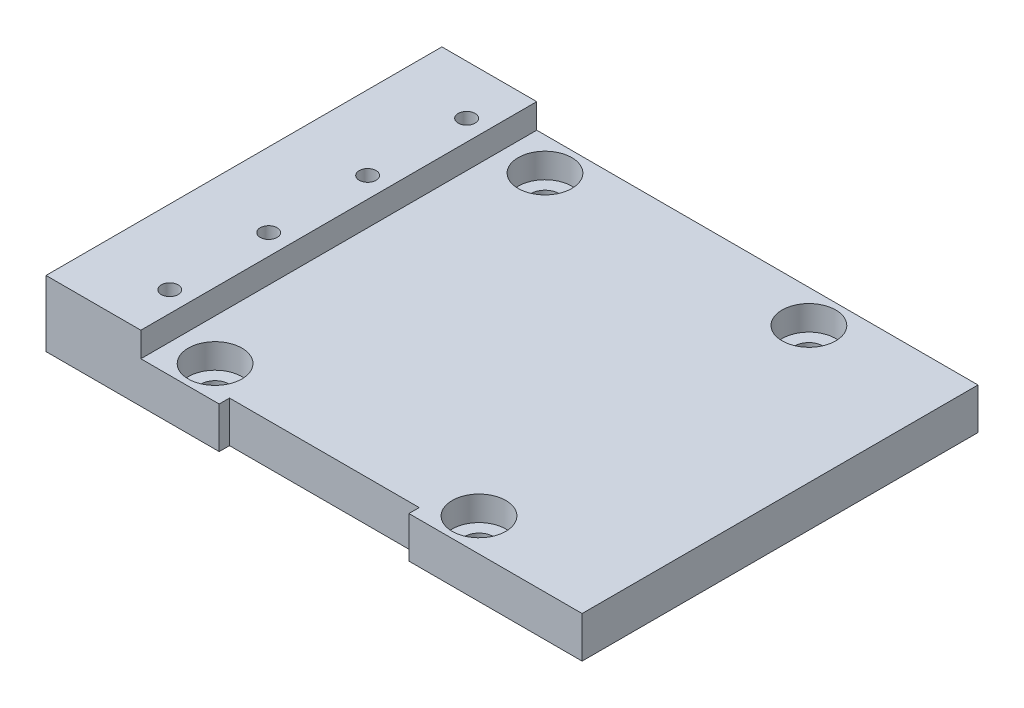
ISO-10303-21;
HEADER;
FILE_DESCRIPTION(('STEP AP214'),'2;1');
FILE_NAME('part.step','',(''),(''),'','','');
FILE_SCHEMA(('AUTOMOTIVE_DESIGN { 1 0 10303 214 1 1 1 1 }'));
ENDSEC;
DATA;
#1=APPLICATION_CONTEXT('core data for automotive mechanical design processes');
#2=APPLICATION_PROTOCOL_DEFINITION('international standard','automotive_design',2000,#1);
#3=PRODUCT_CONTEXT('',#1,'mechanical');
#4=PRODUCT('Part','Part','',(#3));
#5=PRODUCT_RELATED_PRODUCT_CATEGORY('part','',(#4));
#6=PRODUCT_DEFINITION_FORMATION('','',#4);
#7=PRODUCT_DEFINITION_CONTEXT('part definition',#1,'design');
#8=PRODUCT_DEFINITION('design','',#6,#7);
#9=PRODUCT_DEFINITION_SHAPE('','',#8);
#10=(LENGTH_UNIT() NAMED_UNIT(*) SI_UNIT(.MILLI.,.METRE.));
#11=(NAMED_UNIT(*) PLANE_ANGLE_UNIT() SI_UNIT($,.RADIAN.));
#12=(NAMED_UNIT(*) SI_UNIT($,.STERADIAN.) SOLID_ANGLE_UNIT());
#13=UNCERTAINTY_MEASURE_WITH_UNIT(LENGTH_MEASURE(1.E-05),#10,'distance_accuracy_value','');
#14=(GEOMETRIC_REPRESENTATION_CONTEXT(3) GLOBAL_UNCERTAINTY_ASSIGNED_CONTEXT((#13)) GLOBAL_UNIT_ASSIGNED_CONTEXT((#10,
#11,#12)) REPRESENTATION_CONTEXT('',''));
#15=CARTESIAN_POINT('',(0.,0.,0.));
#16=DIRECTION('',(0.,0.,1.));
#17=DIRECTION('',(1.,0.,0.));
#18=AXIS2_PLACEMENT_3D('',#15,#16,#17);
#19=CARTESIAN_POINT('',(-32.5,5.,24.));
#20=DIRECTION('',(0.,0.,-1.));
#21=DIRECTION('',(-1.,0.,0.));
#22=AXIS2_PLACEMENT_3D('',#19,#20,#21);
#23=PLANE('',#22);
#24=DIRECTION('',(1.,0.,0.));
#25=VECTOR('',#24,1.);
#26=CARTESIAN_POINT('',(-32.5,0.,24.));
#27=LINE('',#26,#25);
#28=CARTESIAN_POINT('',(-32.5,0.,24.));
#29=VERTEX_POINT('',#28);
#30=CARTESIAN_POINT('',(-11.5,0.,24.));
#31=VERTEX_POINT('',#30);
#32=EDGE_CURVE('E288',#29,#31,#27,.T.);
#33=ORIENTED_EDGE('',*,*,#32,.T.);
#34=DIRECTION('',(0.,-1.,0.));
#35=VECTOR('',#34,1.);
#36=CARTESIAN_POINT('',(-11.5,5.,24.));
#37=LINE('',#36,#35);
#38=CARTESIAN_POINT('',(-11.5,5.,24.));
#39=VERTEX_POINT('',#38);
#40=EDGE_CURVE('E326',#39,#31,#37,.T.);
#41=ORIENTED_EDGE('',*,*,#40,.F.);
#42=DIRECTION('',(1.,0.,0.));
#43=VECTOR('',#42,1.);
#44=CARTESIAN_POINT('',(-32.5,5.,24.));
#45=LINE('',#44,#43);
#46=CARTESIAN_POINT('',(-21.,5.,24.));
#47=VERTEX_POINT('',#46);
#48=EDGE_CURVE('E292',#47,#39,#45,.T.);
#49=ORIENTED_EDGE('',*,*,#48,.F.);
#50=DIRECTION('',(0.,-1.,0.));
#51=VECTOR('',#50,1.);
#52=CARTESIAN_POINT('',(-21.,8.,24.));
#53=LINE('',#52,#51);
#54=CARTESIAN_POINT('',(-21.,8.,24.));
#55=VERTEX_POINT('',#54);
#56=EDGE_CURVE('E278',#55,#47,#53,.T.);
#57=ORIENTED_EDGE('',*,*,#56,.F.);
#58=DIRECTION('',(1.,0.,0.));
#59=VECTOR('',#58,1.);
#60=CARTESIAN_POINT('',(-32.5,8.,24.));
#61=LINE('',#60,#59);
#62=CARTESIAN_POINT('',(-32.5,8.,24.));
#63=VERTEX_POINT('',#62);
#64=EDGE_CURVE('E262',#63,#55,#61,.T.);
#65=ORIENTED_EDGE('',*,*,#64,.F.);
#66=DIRECTION('',(0.,-1.,0.));
#67=VECTOR('',#66,1.);
#68=CARTESIAN_POINT('',(-32.5,5.,24.));
#69=LINE('',#68,#67);
#70=EDGE_CURVE('E311',#63,#29,#69,.T.);
#71=ORIENTED_EDGE('',*,*,#70,.T.);
#72=EDGE_LOOP('',(#33,#41,#49,#57,#65,#71));
#73=FACE_BOUND('',#72,.T.);
#74=ADVANCED_FACE('F50',(#73),#23,.F.);
#75=CARTESIAN_POINT('',(32.5,5.,-24.));
#76=DIRECTION('',(-1.,0.,0.));
#77=DIRECTION('',(0.,0.,1.));
#78=AXIS2_PLACEMENT_3D('',#75,#76,#77);
#79=PLANE('',#78);
#80=DIRECTION('',(0.,0.,-1.));
#81=VECTOR('',#80,1.);
#82=CARTESIAN_POINT('',(32.5,0.,-24.));
#83=LINE('',#82,#81);
#84=CARTESIAN_POINT('',(32.5,0.,24.));
#85=VERTEX_POINT('',#84);
#86=CARTESIAN_POINT('',(32.5,0.,-24.));
#87=VERTEX_POINT('',#86);
#88=EDGE_CURVE('E282',#85,#87,#83,.T.);
#89=ORIENTED_EDGE('',*,*,#88,.T.);
#90=DIRECTION('',(0.,-1.,0.));
#91=VECTOR('',#90,1.);
#92=CARTESIAN_POINT('',(32.5,5.,-24.));
#93=LINE('',#92,#91);
#94=CARTESIAN_POINT('',(32.5,5.,-24.));
#95=VERTEX_POINT('',#94);
#96=EDGE_CURVE('E11',#95,#87,#93,.T.);
#97=ORIENTED_EDGE('',*,*,#96,.F.);
#98=DIRECTION('',(0.,0.,-1.));
#99=VECTOR('',#98,1.);
#100=CARTESIAN_POINT('',(32.5,5.,-24.));
#101=LINE('',#100,#99);
#102=CARTESIAN_POINT('',(32.5,5.,24.));
#103=VERTEX_POINT('',#102);
#104=EDGE_CURVE('E283',#103,#95,#101,.T.);
#105=ORIENTED_EDGE('',*,*,#104,.F.);
#106=DIRECTION('',(0.,-1.,0.));
#107=VECTOR('',#106,1.);
#108=CARTESIAN_POINT('',(32.5,5.,24.));
#109=LINE('',#108,#107);
#110=EDGE_CURVE('E295',#103,#85,#109,.T.);
#111=ORIENTED_EDGE('',*,*,#110,.T.);
#112=EDGE_LOOP('',(#89,#97,#105,#111));
#113=FACE_BOUND('',#112,.T.);
#114=ADVANCED_FACE('F52',(#113),#79,.F.);
#115=CARTESIAN_POINT('',(-32.5,5.,-24.));
#116=DIRECTION('',(0.,0.,1.));
#117=DIRECTION('',(1.,0.,0.));
#118=AXIS2_PLACEMENT_3D('',#115,#116,#117);
#119=PLANE('',#118);
#120=DIRECTION('',(-1.,0.,0.));
#121=VECTOR('',#120,1.);
#122=CARTESIAN_POINT('',(-32.5,0.,-24.));
#123=LINE('',#122,#121);
#124=CARTESIAN_POINT('',(-32.5,0.,-24.));
#125=VERTEX_POINT('',#124);
#126=EDGE_CURVE('E299',#87,#125,#123,.T.);
#127=ORIENTED_EDGE('',*,*,#126,.T.);
#128=DIRECTION('',(0.,-1.,0.));
#129=VECTOR('',#128,1.);
#130=CARTESIAN_POINT('',(-32.5,5.,-24.));
#131=LINE('',#130,#129);
#132=CARTESIAN_POINT('',(-32.5,8.,-24.));
#133=VERTEX_POINT('',#132);
#134=EDGE_CURVE('E59',#133,#125,#131,.T.);
#135=ORIENTED_EDGE('',*,*,#134,.F.);
#136=DIRECTION('',(-1.,0.,0.));
#137=VECTOR('',#136,1.);
#138=CARTESIAN_POINT('',(-32.5,8.,-24.));
#139=LINE('',#138,#137);
#140=CARTESIAN_POINT('',(-21.,8.,-24.));
#141=VERTEX_POINT('',#140);
#142=EDGE_CURVE('E268',#141,#133,#139,.T.);
#143=ORIENTED_EDGE('',*,*,#142,.F.);
#144=DIRECTION('',(0.,-1.,0.));
#145=VECTOR('',#144,1.);
#146=CARTESIAN_POINT('',(-21.,8.,-24.));
#147=LINE('',#146,#145);
#148=CARTESIAN_POINT('',(-21.,5.,-24.));
#149=VERTEX_POINT('',#148);
#150=EDGE_CURVE('E272',#141,#149,#147,.T.);
#151=ORIENTED_EDGE('',*,*,#150,.T.);
#152=DIRECTION('',(-1.,0.,0.));
#153=VECTOR('',#152,1.);
#154=CARTESIAN_POINT('',(-32.5,5.,-24.));
#155=LINE('',#154,#153);
#156=EDGE_CURVE('E287',#95,#149,#155,.T.);
#157=ORIENTED_EDGE('',*,*,#156,.F.);
#158=ORIENTED_EDGE('',*,*,#96,.T.);
#159=EDGE_LOOP('',(#127,#135,#143,#151,#157,#158));
#160=FACE_BOUND('',#159,.T.);
#161=ADVANCED_FACE('F333',(#160),#119,.F.);
#162=CARTESIAN_POINT('',(-32.5,5.,-24.));
#163=DIRECTION('',(1.,0.,0.));
#164=DIRECTION('',(0.,0.,-1.));
#165=AXIS2_PLACEMENT_3D('',#162,#163,#164);
#166=PLANE('',#165);
#167=DIRECTION('',(0.,0.,1.));
#168=VECTOR('',#167,1.);
#169=CARTESIAN_POINT('',(-32.5,0.,-24.));
#170=LINE('',#169,#168);
#171=EDGE_CURVE('E302',#125,#29,#170,.T.);
#172=ORIENTED_EDGE('',*,*,#171,.T.);
#173=ORIENTED_EDGE('',*,*,#70,.F.);
#174=DIRECTION('',(0.,0.,1.));
#175=VECTOR('',#174,1.);
#176=CARTESIAN_POINT('',(-32.5,8.,-24.));
#177=LINE('',#176,#175);
#178=EDGE_CURVE('E258',#133,#63,#177,.T.);
#179=ORIENTED_EDGE('',*,*,#178,.F.);
#180=ORIENTED_EDGE('',*,*,#134,.T.);
#181=EDGE_LOOP('',(#172,#173,#179,#180));
#182=FACE_BOUND('',#181,.T.);
#183=ADVANCED_FACE('F320',(#182),#166,.F.);
#184=CARTESIAN_POINT('',(11.5,5.,24.));
#185=VERTEX_POINT('',#184);
#186=EDGE_CURVE('E291',#185,#103,#45,.T.);
#187=ORIENTED_EDGE('',*,*,#186,.F.);
#188=DIRECTION('',(0.,1.,0.));
#189=VECTOR('',#188,1.);
#190=CARTESIAN_POINT('',(11.5,5.,24.));
#191=LINE('',#190,#189);
#192=CARTESIAN_POINT('',(11.5,0.,24.));
#193=VERTEX_POINT('',#192);
#194=EDGE_CURVE('E365',#193,#185,#191,.T.);
#195=ORIENTED_EDGE('',*,*,#194,.F.);
#196=EDGE_CURVE('E150',#193,#85,#27,.T.);
#197=ORIENTED_EDGE('',*,*,#196,.T.);
#198=ORIENTED_EDGE('',*,*,#110,.F.);
#199=EDGE_LOOP('',(#187,#195,#197,#198));
#200=FACE_BOUND('',#199,.T.);
#201=ADVANCED_FACE('F351',(#200),#23,.F.);
#202=CARTESIAN_POINT('',(0.,5.,0.));
#203=DIRECTION('',(0.,1.,0.));
#204=DIRECTION('',(0.,0.,1.));
#205=AXIS2_PLACEMENT_3D('',#202,#203,#204);
#206=PLANE('',#205);
#207=DIRECTION('',(0.,0.,1.));
#208=VECTOR('',#207,1.);
#209=CARTESIAN_POINT('',(-11.5,5.,22.75));
#210=LINE('',#209,#208);
#211=CARTESIAN_POINT('',(-11.5,5.,22.75));
#212=VERTEX_POINT('',#211);
#213=EDGE_CURVE('E157',#212,#39,#210,.T.);
#214=ORIENTED_EDGE('',*,*,#213,.F.);
#215=DIRECTION('',(-1.,0.,0.));
#216=VECTOR('',#215,1.);
#217=CARTESIAN_POINT('',(-11.5,5.,22.75));
#218=LINE('',#217,#216);
#219=CARTESIAN_POINT('',(11.5,5.,22.75));
#220=VERTEX_POINT('',#219);
#221=EDGE_CURVE('E138',#220,#212,#218,.T.);
#222=ORIENTED_EDGE('',*,*,#221,.F.);
#223=DIRECTION('',(0.,0.,1.));
#224=VECTOR('',#223,1.);
#225=CARTESIAN_POINT('',(11.5,5.,22.75));
#226=LINE('',#225,#224);
#227=EDGE_CURVE('E135',#220,#185,#226,.T.);
#228=ORIENTED_EDGE('',*,*,#227,.T.);
#229=ORIENTED_EDGE('',*,*,#186,.T.);
#230=ORIENTED_EDGE('',*,*,#104,.T.);
#231=ORIENTED_EDGE('',*,*,#156,.T.);
#232=DIRECTION('',(0.,0.,-1.));
#233=VECTOR('',#232,1.);
#234=CARTESIAN_POINT('',(-21.,5.,-24.));
#235=LINE('',#234,#233);
#236=EDGE_CURVE('E74',#47,#149,#235,.T.);
#237=ORIENTED_EDGE('',*,*,#236,.F.);
#238=ORIENTED_EDGE('',*,*,#48,.T.);
#239=EDGE_LOOP('',(#214,#222,#228,#229,#230,#231,#237,#238));
#240=FACE_BOUND('',#239,.T.);
#241=CARTESIAN_POINT('',(-16.,5.,-20.));
#242=DIRECTION('',(0.,1.,0.));
#243=DIRECTION('',(0.,0.,1.));
#244=AXIS2_PLACEMENT_3D('',#241,#242,#243);
#245=CIRCLE('',#244,3.25);
#246=CARTESIAN_POINT('',(-16.,5.,-16.75));
#247=VERTEX_POINT('',#246);
#248=EDGE_CURVE('E162',#247,#247,#245,.T.);
#249=ORIENTED_EDGE('',*,*,#248,.F.);
#250=EDGE_LOOP('',(#249));
#251=FACE_BOUND('',#250,.T.);
#252=CARTESIAN_POINT('',(16.,5.,-20.));
#253=DIRECTION('',(0.,1.,0.));
#254=DIRECTION('',(0.,0.,1.));
#255=AXIS2_PLACEMENT_3D('',#252,#253,#254);
#256=CIRCLE('',#255,3.25);
#257=CARTESIAN_POINT('',(16.,5.,-16.75));
#258=VERTEX_POINT('',#257);
#259=EDGE_CURVE('E178',#258,#258,#256,.T.);
#260=ORIENTED_EDGE('',*,*,#259,.F.);
#261=EDGE_LOOP('',(#260));
#262=FACE_BOUND('',#261,.T.);
#263=CARTESIAN_POINT('',(-16.,5.,20.));
#264=DIRECTION('',(0.,1.,0.));
#265=DIRECTION('',(0.,0.,1.));
#266=AXIS2_PLACEMENT_3D('',#263,#264,#265);
#267=CIRCLE('',#266,3.25);
#268=CARTESIAN_POINT('',(-16.,5.,23.25));
#269=VERTEX_POINT('',#268);
#270=EDGE_CURVE('E194',#269,#269,#267,.T.);
#271=ORIENTED_EDGE('',*,*,#270,.F.);
#272=EDGE_LOOP('',(#271));
#273=FACE_BOUND('',#272,.T.);
#274=CARTESIAN_POINT('',(16.,5.,20.));
#275=DIRECTION('',(0.,1.,0.));
#276=DIRECTION('',(0.,0.,1.));
#277=AXIS2_PLACEMENT_3D('',#274,#275,#276);
#278=CIRCLE('',#277,3.25);
#279=CARTESIAN_POINT('',(16.,5.,23.25));
#280=VERTEX_POINT('',#279);
#281=EDGE_CURVE('E210',#280,#280,#278,.T.);
#282=ORIENTED_EDGE('',*,*,#281,.F.);
#283=EDGE_LOOP('',(#282));
#284=FACE_BOUND('',#283,.T.);
#285=ADVANCED_FACE('F345',(#240,#251,#262,#273,#284),#206,.T.);
#286=CARTESIAN_POINT('',(0.,0.,0.));
#287=DIRECTION('',(0.,1.,0.));
#288=DIRECTION('',(0.,0.,1.));
#289=AXIS2_PLACEMENT_3D('',#286,#287,#288);
#290=PLANE('',#289);
#291=CARTESIAN_POINT('',(-16.,0.,-20.));
#292=DIRECTION('',(0.,1.,0.));
#293=DIRECTION('',(0.,0.,1.));
#294=AXIS2_PLACEMENT_3D('',#291,#292,#293);
#295=CIRCLE('',#294,1.7);
#296=CARTESIAN_POINT('',(-16.,0.,-18.3));
#297=VERTEX_POINT('',#296);
#298=EDGE_CURVE('E174',#297,#297,#295,.T.);
#299=ORIENTED_EDGE('',*,*,#298,.T.);
#300=EDGE_LOOP('',(#299));
#301=FACE_BOUND('',#300,.T.);
#302=CARTESIAN_POINT('',(16.,0.,-20.));
#303=DIRECTION('',(0.,1.,0.));
#304=DIRECTION('',(0.,0.,1.));
#305=AXIS2_PLACEMENT_3D('',#302,#303,#304);
#306=CIRCLE('',#305,1.7);
#307=CARTESIAN_POINT('',(16.,0.,-18.3));
#308=VERTEX_POINT('',#307);
#309=EDGE_CURVE('E190',#308,#308,#306,.T.);
#310=ORIENTED_EDGE('',*,*,#309,.T.);
#311=EDGE_LOOP('',(#310));
#312=FACE_BOUND('',#311,.T.);
#313=CARTESIAN_POINT('',(-16.,0.,20.));
#314=DIRECTION('',(0.,1.,0.));
#315=DIRECTION('',(0.,0.,1.));
#316=AXIS2_PLACEMENT_3D('',#313,#314,#315);
#317=CIRCLE('',#316,1.7);
#318=CARTESIAN_POINT('',(-16.,0.,21.7));
#319=VERTEX_POINT('',#318);
#320=EDGE_CURVE('E206',#319,#319,#317,.T.);
#321=ORIENTED_EDGE('',*,*,#320,.T.);
#322=EDGE_LOOP('',(#321));
#323=FACE_BOUND('',#322,.T.);
#324=CARTESIAN_POINT('',(16.,0.,20.));
#325=DIRECTION('',(0.,1.,0.));
#326=DIRECTION('',(0.,0.,1.));
#327=AXIS2_PLACEMENT_3D('',#324,#325,#326);
#328=CIRCLE('',#327,1.7);
#329=CARTESIAN_POINT('',(16.,0.,21.7));
#330=VERTEX_POINT('',#329);
#331=EDGE_CURVE('E222',#330,#330,#328,.T.);
#332=ORIENTED_EDGE('',*,*,#331,.T.);
#333=EDGE_LOOP('',(#332));
#334=FACE_BOUND('',#333,.T.);
#335=DIRECTION('',(1.,0.,0.));
#336=VECTOR('',#335,1.);
#337=CARTESIAN_POINT('',(-11.5,0.,22.75));
#338=LINE('',#337,#336);
#339=CARTESIAN_POINT('',(-11.5,0.,22.75));
#340=VERTEX_POINT('',#339);
#341=CARTESIAN_POINT('',(11.5,0.,22.75));
#342=VERTEX_POINT('',#341);
#343=EDGE_CURVE('E139',#340,#342,#338,.T.);
#344=ORIENTED_EDGE('',*,*,#343,.F.);
#345=DIRECTION('',(0.,0.,1.));
#346=VECTOR('',#345,1.);
#347=CARTESIAN_POINT('',(-11.5,0.,22.75));
#348=LINE('',#347,#346);
#349=EDGE_CURVE('E152',#340,#31,#348,.T.);
#350=ORIENTED_EDGE('',*,*,#349,.T.);
#351=ORIENTED_EDGE('',*,*,#32,.F.);
#352=ORIENTED_EDGE('',*,*,#171,.F.);
#353=ORIENTED_EDGE('',*,*,#126,.F.);
#354=ORIENTED_EDGE('',*,*,#88,.F.);
#355=ORIENTED_EDGE('',*,*,#196,.F.);
#356=DIRECTION('',(0.,0.,1.));
#357=VECTOR('',#356,1.);
#358=CARTESIAN_POINT('',(11.5,0.,22.75));
#359=LINE('',#358,#357);
#360=EDGE_CURVE('E132',#342,#193,#359,.T.);
#361=ORIENTED_EDGE('',*,*,#360,.F.);
#362=EDGE_LOOP('',(#344,#350,#351,#352,#353,#354,#355,#361));
#363=FACE_BOUND('',#362,.T.);
#364=ADVANCED_FACE('F148',(#301,#312,#323,#334,#363),#290,.F.);
#365=CARTESIAN_POINT('',(-21.,8.,-24.));
#366=DIRECTION('',(-1.,0.,0.));
#367=DIRECTION('',(0.,0.,1.));
#368=AXIS2_PLACEMENT_3D('',#365,#366,#367);
#369=PLANE('',#368);
#370=ORIENTED_EDGE('',*,*,#236,.T.);
#371=ORIENTED_EDGE('',*,*,#150,.F.);
#372=DIRECTION('',(0.,0.,-1.));
#373=VECTOR('',#372,1.);
#374=CARTESIAN_POINT('',(-21.,8.,-24.));
#375=LINE('',#374,#373);
#376=EDGE_CURVE('E265',#55,#141,#375,.T.);
#377=ORIENTED_EDGE('',*,*,#376,.F.);
#378=ORIENTED_EDGE('',*,*,#56,.T.);
#379=EDGE_LOOP('',(#370,#371,#377,#378));
#380=FACE_BOUND('',#379,.T.);
#381=ADVANCED_FACE('F335',(#380),#369,.F.);
#382=CARTESIAN_POINT('',(0.,8.,0.));
#383=DIRECTION('',(0.,1.,0.));
#384=DIRECTION('',(0.,0.,1.));
#385=AXIS2_PLACEMENT_3D('',#382,#383,#384);
#386=PLANE('',#385);
#387=CARTESIAN_POINT('',(-23.5,8.,-18.));
#388=DIRECTION('',(0.,1.,0.));
#389=DIRECTION('',(0.,0.,1.));
#390=AXIS2_PLACEMENT_3D('',#387,#388,#389);
#391=CIRCLE('',#390,1.02499999999999);
#392=CARTESIAN_POINT('',(-23.5,8.,-16.975));
#393=VERTEX_POINT('',#392);
#394=EDGE_CURVE('E226',#393,#393,#391,.T.);
#395=ORIENTED_EDGE('',*,*,#394,.F.);
#396=EDGE_LOOP('',(#395));
#397=FACE_BOUND('',#396,.T.);
#398=CARTESIAN_POINT('',(-23.5,8.,-5.99999999999999));
#399=DIRECTION('',(0.,1.,0.));
#400=DIRECTION('',(0.,0.,1.));
#401=AXIS2_PLACEMENT_3D('',#398,#399,#400);
#402=CIRCLE('',#401,1.02499999999999);
#403=CARTESIAN_POINT('',(-23.5,8.,-4.975));
#404=VERTEX_POINT('',#403);
#405=EDGE_CURVE('E234',#404,#404,#402,.T.);
#406=ORIENTED_EDGE('',*,*,#405,.F.);
#407=EDGE_LOOP('',(#406));
#408=FACE_BOUND('',#407,.T.);
#409=CARTESIAN_POINT('',(-23.5,8.,18.));
#410=DIRECTION('',(0.,1.,0.));
#411=DIRECTION('',(0.,0.,1.));
#412=AXIS2_PLACEMENT_3D('',#409,#410,#411);
#413=CIRCLE('',#412,1.02499999999999);
#414=CARTESIAN_POINT('',(-23.5,8.,19.025));
#415=VERTEX_POINT('',#414);
#416=EDGE_CURVE('E242',#415,#415,#413,.T.);
#417=ORIENTED_EDGE('',*,*,#416,.F.);
#418=EDGE_LOOP('',(#417));
#419=FACE_BOUND('',#418,.T.);
#420=CARTESIAN_POINT('',(-23.5,8.,6.00000000000001));
#421=DIRECTION('',(0.,1.,0.));
#422=DIRECTION('',(0.,0.,1.));
#423=AXIS2_PLACEMENT_3D('',#420,#421,#422);
#424=CIRCLE('',#423,1.02499999999999);
#425=CARTESIAN_POINT('',(-23.5,8.,7.025));
#426=VERTEX_POINT('',#425);
#427=EDGE_CURVE('E250',#426,#426,#424,.T.);
#428=ORIENTED_EDGE('',*,*,#427,.F.);
#429=EDGE_LOOP('',(#428));
#430=FACE_BOUND('',#429,.T.);
#431=ORIENTED_EDGE('',*,*,#178,.T.);
#432=ORIENTED_EDGE('',*,*,#64,.T.);
#433=ORIENTED_EDGE('',*,*,#376,.T.);
#434=ORIENTED_EDGE('',*,*,#142,.T.);
#435=EDGE_LOOP('',(#431,#432,#433,#434));
#436=FACE_BOUND('',#435,.T.);
#437=ADVANCED_FACE('F331',(#397,#408,#419,#430,#436),#386,.T.);
#438=CARTESIAN_POINT('',(-23.5,1.65,6.00000000000001));
#439=DIRECTION('',(0.,-1.,0.));
#440=DIRECTION('',(0.,0.,-1.));
#441=AXIS2_PLACEMENT_3D('',#438,#439,#440);
#442=PLANE('',#441);
#443=CARTESIAN_POINT('',(-23.5,1.65,6.00000000000001));
#444=DIRECTION('',(0.,1.,0.));
#445=DIRECTION('',(0.,0.,1.));
#446=AXIS2_PLACEMENT_3D('',#443,#444,#445);
#447=CIRCLE('',#446,1.025);
#448=CARTESIAN_POINT('',(-23.5,1.65,7.02500000000001));
#449=VERTEX_POINT('',#448);
#450=EDGE_CURVE('E254',#449,#449,#447,.T.);
#451=ORIENTED_EDGE('',*,*,#450,.T.);
#452=EDGE_LOOP('',(#451));
#453=FACE_BOUND('',#452,.T.);
#454=ADVANCED_FACE('F342',(#453),#442,.F.);
#455=CARTESIAN_POINT('',(-23.5,8.,6.00000000000001));
#456=DIRECTION('',(0.,1.,0.));
#457=DIRECTION('',(0.,0.,1.));
#458=AXIS2_PLACEMENT_3D('',#455,#456,#457);
#459=CYLINDRICAL_SURFACE('',#458,1.02499999999999);
#460=ORIENTED_EDGE('',*,*,#450,.F.);
#461=EDGE_LOOP('',(#460));
#462=FACE_BOUND('',#461,.T.);
#463=ORIENTED_EDGE('',*,*,#427,.T.);
#464=EDGE_LOOP('',(#463));
#465=FACE_BOUND('',#464,.T.);
#466=ADVANCED_FACE('F533',(#462,#465),#459,.F.);
#467=CARTESIAN_POINT('',(-23.5,1.65,18.));
#468=DIRECTION('',(0.,-1.,0.));
#469=DIRECTION('',(0.,0.,-1.));
#470=AXIS2_PLACEMENT_3D('',#467,#468,#469);
#471=PLANE('',#470);
#472=CARTESIAN_POINT('',(-23.5,1.65,18.));
#473=DIRECTION('',(0.,1.,0.));
#474=DIRECTION('',(0.,0.,1.));
#475=AXIS2_PLACEMENT_3D('',#472,#473,#474);
#476=CIRCLE('',#475,1.025);
#477=CARTESIAN_POINT('',(-23.5,1.65,19.025));
#478=VERTEX_POINT('',#477);
#479=EDGE_CURVE('E246',#478,#478,#476,.T.);
#480=ORIENTED_EDGE('',*,*,#479,.T.);
#481=EDGE_LOOP('',(#480));
#482=FACE_BOUND('',#481,.T.);
#483=ADVANCED_FACE('F529',(#482),#471,.F.);
#484=CARTESIAN_POINT('',(-23.5,8.,18.));
#485=DIRECTION('',(0.,1.,0.));
#486=DIRECTION('',(0.,0.,1.));
#487=AXIS2_PLACEMENT_3D('',#484,#485,#486);
#488=CYLINDRICAL_SURFACE('',#487,1.02499999999999);
#489=ORIENTED_EDGE('',*,*,#479,.F.);
#490=EDGE_LOOP('',(#489));
#491=FACE_BOUND('',#490,.T.);
#492=ORIENTED_EDGE('',*,*,#416,.T.);
#493=EDGE_LOOP('',(#492));
#494=FACE_BOUND('',#493,.T.);
#495=ADVANCED_FACE('F525',(#491,#494),#488,.F.);
#496=CARTESIAN_POINT('',(-23.5,1.65,-5.99999999999999));
#497=DIRECTION('',(0.,-1.,0.));
#498=DIRECTION('',(0.,0.,-1.));
#499=AXIS2_PLACEMENT_3D('',#496,#497,#498);
#500=PLANE('',#499);
#501=CARTESIAN_POINT('',(-23.5,1.65,-5.99999999999999));
#502=DIRECTION('',(0.,1.,0.));
#503=DIRECTION('',(0.,0.,1.));
#504=AXIS2_PLACEMENT_3D('',#501,#502,#503);
#505=CIRCLE('',#504,1.025);
#506=CARTESIAN_POINT('',(-23.5,1.65,-4.97499999999999));
#507=VERTEX_POINT('',#506);
#508=EDGE_CURVE('E238',#507,#507,#505,.T.);
#509=ORIENTED_EDGE('',*,*,#508,.T.);
#510=EDGE_LOOP('',(#509));
#511=FACE_BOUND('',#510,.T.);
#512=ADVANCED_FACE('F521',(#511),#500,.F.);
#513=CARTESIAN_POINT('',(-23.5,8.,-5.99999999999999));
#514=DIRECTION('',(0.,1.,0.));
#515=DIRECTION('',(0.,0.,1.));
#516=AXIS2_PLACEMENT_3D('',#513,#514,#515);
#517=CYLINDRICAL_SURFACE('',#516,1.02499999999999);
#518=ORIENTED_EDGE('',*,*,#508,.F.);
#519=EDGE_LOOP('',(#518));
#520=FACE_BOUND('',#519,.T.);
#521=ORIENTED_EDGE('',*,*,#405,.T.);
#522=EDGE_LOOP('',(#521));
#523=FACE_BOUND('',#522,.T.);
#524=ADVANCED_FACE('F517',(#520,#523),#517,.F.);
#525=CARTESIAN_POINT('',(-23.5,1.65,-18.));
#526=DIRECTION('',(0.,-1.,0.));
#527=DIRECTION('',(0.,0.,-1.));
#528=AXIS2_PLACEMENT_3D('',#525,#526,#527);
#529=PLANE('',#528);
#530=CARTESIAN_POINT('',(-23.5,1.65,-18.));
#531=DIRECTION('',(0.,1.,0.));
#532=DIRECTION('',(0.,0.,1.));
#533=AXIS2_PLACEMENT_3D('',#530,#531,#532);
#534=CIRCLE('',#533,1.025);
#535=CARTESIAN_POINT('',(-23.5,1.65,-16.975));
#536=VERTEX_POINT('',#535);
#537=EDGE_CURVE('E230',#536,#536,#534,.T.);
#538=ORIENTED_EDGE('',*,*,#537,.T.);
#539=EDGE_LOOP('',(#538));
#540=FACE_BOUND('',#539,.T.);
#541=ADVANCED_FACE('F513',(#540),#529,.F.);
#542=CARTESIAN_POINT('',(-23.5,8.,-18.));
#543=DIRECTION('',(0.,1.,0.));
#544=DIRECTION('',(0.,0.,1.));
#545=AXIS2_PLACEMENT_3D('',#542,#543,#544);
#546=CYLINDRICAL_SURFACE('',#545,1.02499999999999);
#547=ORIENTED_EDGE('',*,*,#537,.F.);
#548=EDGE_LOOP('',(#547));
#549=FACE_BOUND('',#548,.T.);
#550=ORIENTED_EDGE('',*,*,#394,.T.);
#551=EDGE_LOOP('',(#550));
#552=FACE_BOUND('',#551,.T.);
#553=ADVANCED_FACE('F509',(#549,#552),#546,.F.);
#554=CARTESIAN_POINT('',(16.,5.,20.));
#555=DIRECTION('',(0.,1.,0.));
#556=DIRECTION('',(0.,0.,1.));
#557=AXIS2_PLACEMENT_3D('',#554,#555,#556);
#558=CYLINDRICAL_SURFACE('',#557,1.7);
#559=ORIENTED_EDGE('',*,*,#331,.F.);
#560=EDGE_LOOP('',(#559));
#561=FACE_BOUND('',#560,.T.);
#562=CARTESIAN_POINT('',(16.,2.,20.));
#563=DIRECTION('',(0.,1.,0.));
#564=DIRECTION('',(0.,0.,1.));
#565=AXIS2_PLACEMENT_3D('',#562,#563,#564);
#566=CIRCLE('',#565,1.7);
#567=CARTESIAN_POINT('',(16.,2.,21.7));
#568=VERTEX_POINT('',#567);
#569=EDGE_CURVE('E218',#568,#568,#566,.T.);
#570=ORIENTED_EDGE('',*,*,#569,.T.);
#571=EDGE_LOOP('',(#570));
#572=FACE_BOUND('',#571,.T.);
#573=ADVANCED_FACE('F501',(#561,#572),#558,.F.);
#574=CARTESIAN_POINT('',(17.7,2.,20.));
#575=DIRECTION('',(0.,-1.,0.));
#576=DIRECTION('',(0.,0.,-1.));
#577=AXIS2_PLACEMENT_3D('',#574,#575,#576);
#578=PLANE('',#577);
#579=ORIENTED_EDGE('',*,*,#569,.F.);
#580=EDGE_LOOP('',(#579));
#581=FACE_BOUND('',#580,.T.);
#582=CARTESIAN_POINT('',(16.,2.,20.));
#583=DIRECTION('',(0.,1.,0.));
#584=DIRECTION('',(0.,0.,1.));
#585=AXIS2_PLACEMENT_3D('',#582,#583,#584);
#586=CIRCLE('',#585,3.25);
#587=CARTESIAN_POINT('',(16.,2.,23.25));
#588=VERTEX_POINT('',#587);
#589=EDGE_CURVE('E214',#588,#588,#586,.T.);
#590=ORIENTED_EDGE('',*,*,#589,.T.);
#591=EDGE_LOOP('',(#590));
#592=FACE_BOUND('',#591,.T.);
#593=ADVANCED_FACE('F491',(#581,#592),#578,.F.);
#594=CARTESIAN_POINT('',(16.,5.,20.));
#595=DIRECTION('',(0.,1.,0.));
#596=DIRECTION('',(0.,0.,1.));
#597=AXIS2_PLACEMENT_3D('',#594,#595,#596);
#598=CYLINDRICAL_SURFACE('',#597,3.25);
#599=ORIENTED_EDGE('',*,*,#589,.F.);
#600=EDGE_LOOP('',(#599));
#601=FACE_BOUND('',#600,.T.);
#602=ORIENTED_EDGE('',*,*,#281,.T.);
#603=EDGE_LOOP('',(#602));
#604=FACE_BOUND('',#603,.T.);
#605=ADVANCED_FACE('F488',(#601,#604),#598,.F.);
#606=CARTESIAN_POINT('',(-16.,5.,20.));
#607=DIRECTION('',(0.,1.,0.));
#608=DIRECTION('',(0.,0.,1.));
#609=AXIS2_PLACEMENT_3D('',#606,#607,#608);
#610=CYLINDRICAL_SURFACE('',#609,1.7);
#611=ORIENTED_EDGE('',*,*,#320,.F.);
#612=EDGE_LOOP('',(#611));
#613=FACE_BOUND('',#612,.T.);
#614=CARTESIAN_POINT('',(-16.,2.,20.));
#615=DIRECTION('',(0.,1.,0.));
#616=DIRECTION('',(0.,0.,1.));
#617=AXIS2_PLACEMENT_3D('',#614,#615,#616);
#618=CIRCLE('',#617,1.7);
#619=CARTESIAN_POINT('',(-16.,2.,21.7));
#620=VERTEX_POINT('',#619);
#621=EDGE_CURVE('E202',#620,#620,#618,.T.);
#622=ORIENTED_EDGE('',*,*,#621,.T.);
#623=EDGE_LOOP('',(#622));
#624=FACE_BOUND('',#623,.T.);
#625=ADVANCED_FACE('F490',(#613,#624),#610,.F.);
#626=CARTESIAN_POINT('',(-14.3,2.,20.));
#627=DIRECTION('',(0.,-1.,0.));
#628=DIRECTION('',(0.,0.,-1.));
#629=AXIS2_PLACEMENT_3D('',#626,#627,#628);
#630=PLANE('',#629);
#631=ORIENTED_EDGE('',*,*,#621,.F.);
#632=EDGE_LOOP('',(#631));
#633=FACE_BOUND('',#632,.T.);
#634=CARTESIAN_POINT('',(-16.,2.,20.));
#635=DIRECTION('',(0.,1.,0.));
#636=DIRECTION('',(0.,0.,1.));
#637=AXIS2_PLACEMENT_3D('',#634,#635,#636);
#638=CIRCLE('',#637,3.25);
#639=CARTESIAN_POINT('',(-16.,2.,23.25));
#640=VERTEX_POINT('',#639);
#641=EDGE_CURVE('E198',#640,#640,#638,.T.);
#642=ORIENTED_EDGE('',*,*,#641,.T.);
#643=EDGE_LOOP('',(#642));
#644=FACE_BOUND('',#643,.T.);
#645=ADVANCED_FACE('F498',(#633,#644),#630,.F.);
#646=CARTESIAN_POINT('',(-16.,5.,20.));
#647=DIRECTION('',(0.,1.,0.));
#648=DIRECTION('',(0.,0.,1.));
#649=AXIS2_PLACEMENT_3D('',#646,#647,#648);
#650=CYLINDRICAL_SURFACE('',#649,3.25);
#651=ORIENTED_EDGE('',*,*,#641,.F.);
#652=EDGE_LOOP('',(#651));
#653=FACE_BOUND('',#652,.T.);
#654=ORIENTED_EDGE('',*,*,#270,.T.);
#655=EDGE_LOOP('',(#654));
#656=FACE_BOUND('',#655,.T.);
#657=ADVANCED_FACE('F611',(#653,#656),#650,.F.);
#658=CARTESIAN_POINT('',(16.,5.,-20.));
#659=DIRECTION('',(0.,1.,0.));
#660=DIRECTION('',(0.,0.,1.));
#661=AXIS2_PLACEMENT_3D('',#658,#659,#660);
#662=CYLINDRICAL_SURFACE('',#661,1.7);
#663=ORIENTED_EDGE('',*,*,#309,.F.);
#664=EDGE_LOOP('',(#663));
#665=FACE_BOUND('',#664,.T.);
#666=CARTESIAN_POINT('',(16.,2.,-20.));
#667=DIRECTION('',(0.,1.,0.));
#668=DIRECTION('',(0.,0.,1.));
#669=AXIS2_PLACEMENT_3D('',#666,#667,#668);
#670=CIRCLE('',#669,1.7);
#671=CARTESIAN_POINT('',(16.,2.,-18.3));
#672=VERTEX_POINT('',#671);
#673=EDGE_CURVE('E186',#672,#672,#670,.T.);
#674=ORIENTED_EDGE('',*,*,#673,.T.);
#675=EDGE_LOOP('',(#674));
#676=FACE_BOUND('',#675,.T.);
#677=ADVANCED_FACE('F621',(#665,#676),#662,.F.);
#678=CARTESIAN_POINT('',(17.7,2.,-20.));
#679=DIRECTION('',(0.,-1.,0.));
#680=DIRECTION('',(0.,0.,-1.));
#681=AXIS2_PLACEMENT_3D('',#678,#679,#680);
#682=PLANE('',#681);
#683=ORIENTED_EDGE('',*,*,#673,.F.);
#684=EDGE_LOOP('',(#683));
#685=FACE_BOUND('',#684,.T.);
#686=CARTESIAN_POINT('',(16.,2.,-20.));
#687=DIRECTION('',(0.,1.,0.));
#688=DIRECTION('',(0.,0.,1.));
#689=AXIS2_PLACEMENT_3D('',#686,#687,#688);
#690=CIRCLE('',#689,3.25);
#691=CARTESIAN_POINT('',(16.,2.,-16.75));
#692=VERTEX_POINT('',#691);
#693=EDGE_CURVE('E182',#692,#692,#690,.T.);
#694=ORIENTED_EDGE('',*,*,#693,.T.);
#695=EDGE_LOOP('',(#694));
#696=FACE_BOUND('',#695,.T.);
#697=ADVANCED_FACE('F632',(#685,#696),#682,.F.);
#698=CARTESIAN_POINT('',(16.,5.,-20.));
#699=DIRECTION('',(0.,1.,0.));
#700=DIRECTION('',(0.,0.,1.));
#701=AXIS2_PLACEMENT_3D('',#698,#699,#700);
#702=CYLINDRICAL_SURFACE('',#701,3.25);
#703=ORIENTED_EDGE('',*,*,#693,.F.);
#704=EDGE_LOOP('',(#703));
#705=FACE_BOUND('',#704,.T.);
#706=ORIENTED_EDGE('',*,*,#259,.T.);
#707=EDGE_LOOP('',(#706));
#708=FACE_BOUND('',#707,.T.);
#709=ADVANCED_FACE('F643',(#705,#708),#702,.F.);
#710=CARTESIAN_POINT('',(-16.,5.,-20.));
#711=DIRECTION('',(0.,1.,0.));
#712=DIRECTION('',(0.,0.,1.));
#713=AXIS2_PLACEMENT_3D('',#710,#711,#712);
#714=CYLINDRICAL_SURFACE('',#713,1.7);
#715=ORIENTED_EDGE('',*,*,#298,.F.);
#716=EDGE_LOOP('',(#715));
#717=FACE_BOUND('',#716,.T.);
#718=CARTESIAN_POINT('',(-16.,2.,-20.));
#719=DIRECTION('',(0.,1.,0.));
#720=DIRECTION('',(0.,0.,1.));
#721=AXIS2_PLACEMENT_3D('',#718,#719,#720);
#722=CIRCLE('',#721,1.7);
#723=CARTESIAN_POINT('',(-16.,2.,-18.3));
#724=VERTEX_POINT('',#723);
#725=EDGE_CURVE('E170',#724,#724,#722,.T.);
#726=ORIENTED_EDGE('',*,*,#725,.T.);
#727=EDGE_LOOP('',(#726));
#728=FACE_BOUND('',#727,.T.);
#729=ADVANCED_FACE('F654',(#717,#728),#714,.F.);
#730=CARTESIAN_POINT('',(-14.3,2.,-20.));
#731=DIRECTION('',(0.,-1.,0.));
#732=DIRECTION('',(0.,0.,-1.));
#733=AXIS2_PLACEMENT_3D('',#730,#731,#732);
#734=PLANE('',#733);
#735=ORIENTED_EDGE('',*,*,#725,.F.);
#736=EDGE_LOOP('',(#735));
#737=FACE_BOUND('',#736,.T.);
#738=CARTESIAN_POINT('',(-16.,2.,-20.));
#739=DIRECTION('',(0.,1.,0.));
#740=DIRECTION('',(0.,0.,1.));
#741=AXIS2_PLACEMENT_3D('',#738,#739,#740);
#742=CIRCLE('',#741,3.25);
#743=CARTESIAN_POINT('',(-16.,2.,-16.75));
#744=VERTEX_POINT('',#743);
#745=EDGE_CURVE('E166',#744,#744,#742,.T.);
#746=ORIENTED_EDGE('',*,*,#745,.T.);
#747=EDGE_LOOP('',(#746));
#748=FACE_BOUND('',#747,.T.);
#749=ADVANCED_FACE('F665',(#737,#748),#734,.F.);
#750=CARTESIAN_POINT('',(-16.,5.,-20.));
#751=DIRECTION('',(0.,1.,0.));
#752=DIRECTION('',(0.,0.,1.));
#753=AXIS2_PLACEMENT_3D('',#750,#751,#752);
#754=CYLINDRICAL_SURFACE('',#753,3.25);
#755=ORIENTED_EDGE('',*,*,#745,.F.);
#756=EDGE_LOOP('',(#755));
#757=FACE_BOUND('',#756,.T.);
#758=ORIENTED_EDGE('',*,*,#248,.T.);
#759=EDGE_LOOP('',(#758));
#760=FACE_BOUND('',#759,.T.);
#761=ADVANCED_FACE('F676',(#757,#760),#754,.F.);
#762=CARTESIAN_POINT('',(-11.5,5.,22.75));
#763=DIRECTION('',(-1.,0.,0.));
#764=DIRECTION('',(0.,0.,1.));
#765=AXIS2_PLACEMENT_3D('',#762,#763,#764);
#766=PLANE('',#765);
#767=ORIENTED_EDGE('',*,*,#40,.T.);
#768=ORIENTED_EDGE('',*,*,#349,.F.);
#769=DIRECTION('',(0.,-1.,0.));
#770=VECTOR('',#769,1.);
#771=CARTESIAN_POINT('',(-11.5,5.,22.75));
#772=LINE('',#771,#770);
#773=EDGE_CURVE('E66',#212,#340,#772,.T.);
#774=ORIENTED_EDGE('',*,*,#773,.F.);
#775=ORIENTED_EDGE('',*,*,#213,.T.);
#776=EDGE_LOOP('',(#767,#768,#774,#775));
#777=FACE_BOUND('',#776,.T.);
#778=ADVANCED_FACE('F477',(#777),#766,.F.);
#779=CARTESIAN_POINT('',(11.5,5.,22.75));
#780=DIRECTION('',(1.,0.,0.));
#781=DIRECTION('',(0.,0.,-1.));
#782=AXIS2_PLACEMENT_3D('',#779,#780,#781);
#783=PLANE('',#782);
#784=ORIENTED_EDGE('',*,*,#194,.T.);
#785=ORIENTED_EDGE('',*,*,#227,.F.);
#786=DIRECTION('',(0.,1.,0.));
#787=VECTOR('',#786,1.);
#788=CARTESIAN_POINT('',(11.5,5.,22.75));
#789=LINE('',#788,#787);
#790=EDGE_CURVE('E129',#342,#220,#789,.T.);
#791=ORIENTED_EDGE('',*,*,#790,.F.);
#792=ORIENTED_EDGE('',*,*,#360,.T.);
#793=EDGE_LOOP('',(#784,#785,#791,#792));
#794=FACE_BOUND('',#793,.T.);
#795=ADVANCED_FACE('F130',(#794),#783,.F.);
#796=CARTESIAN_POINT('',(0.,0.,22.75));
#797=DIRECTION('',(0.,0.,1.));
#798=DIRECTION('',(1.,0.,0.));
#799=AXIS2_PLACEMENT_3D('',#796,#797,#798);
#800=PLANE('',#799);
#801=ORIENTED_EDGE('',*,*,#773,.T.);
#802=ORIENTED_EDGE('',*,*,#343,.T.);
#803=ORIENTED_EDGE('',*,*,#790,.T.);
#804=ORIENTED_EDGE('',*,*,#221,.T.);
#805=EDGE_LOOP('',(#801,#802,#803,#804));
#806=FACE_BOUND('',#805,.T.);
#807=ADVANCED_FACE('F142',(#806),#800,.T.);
#808=CLOSED_SHELL('',(#74,#114,#161,#183,#201,#285,#364,#381,#437,#454,#466,#483,#495,#512,#524,
#541,#553,#573,#593,#605,#625,#645,#657,#677,#697,#709,#729,#749,#761,#778,#795,#807));
#809=MANIFOLD_SOLID_BREP('B2',#808);
#810=ADVANCED_BREP_SHAPE_REPRESENTATION('',(#18,#809),#14);
#811=SHAPE_DEFINITION_REPRESENTATION(#9,#810);
ENDSEC;
END-ISO-10303-21;
